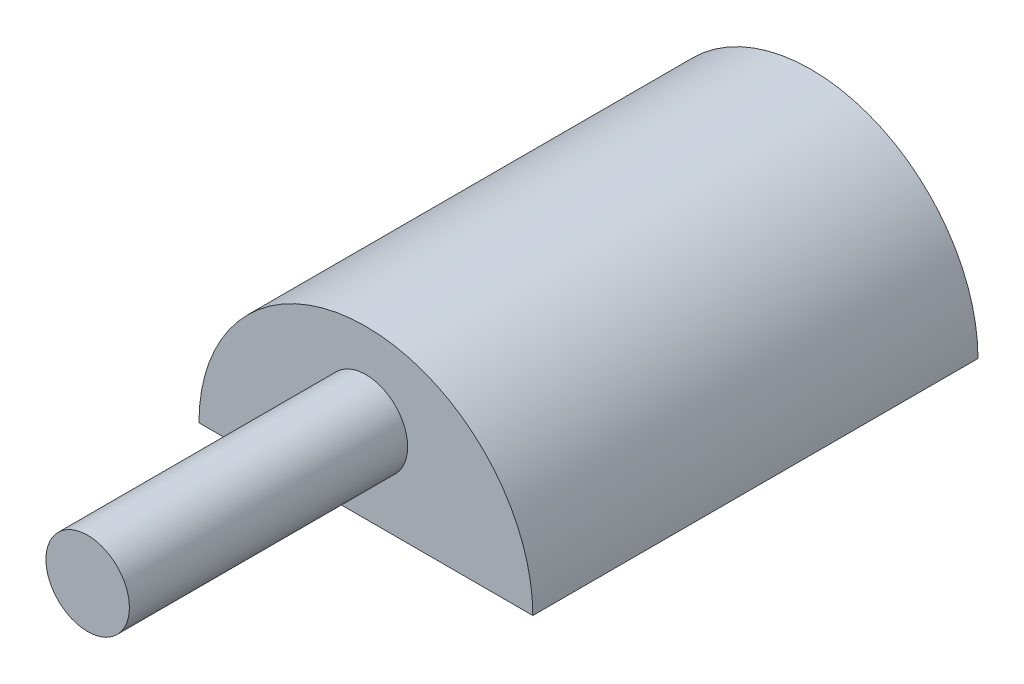
ISO-10303-21;
HEADER;
FILE_DESCRIPTION(('STEP AP214'),'2;1');
FILE_NAME('part.step','',(''),(''),'','','');
FILE_SCHEMA(('AUTOMOTIVE_DESIGN { 1 0 10303 214 1 1 1 1 }'));
ENDSEC;
DATA;
#1=APPLICATION_CONTEXT('core data for automotive mechanical design processes');
#2=APPLICATION_PROTOCOL_DEFINITION('international standard','automotive_design',2000,#1);
#3=PRODUCT_CONTEXT('',#1,'mechanical');
#4=PRODUCT('Part','Part','',(#3));
#5=PRODUCT_RELATED_PRODUCT_CATEGORY('part','',(#4));
#6=PRODUCT_DEFINITION_FORMATION('','',#4);
#7=PRODUCT_DEFINITION_CONTEXT('part definition',#1,'design');
#8=PRODUCT_DEFINITION('design','',#6,#7);
#9=PRODUCT_DEFINITION_SHAPE('','',#8);
#10=(LENGTH_UNIT() NAMED_UNIT(*) SI_UNIT(.MILLI.,.METRE.));
#11=(NAMED_UNIT(*) PLANE_ANGLE_UNIT() SI_UNIT($,.RADIAN.));
#12=(NAMED_UNIT(*) SI_UNIT($,.STERADIAN.) SOLID_ANGLE_UNIT());
#13=UNCERTAINTY_MEASURE_WITH_UNIT(LENGTH_MEASURE(1.E-05),#10,'distance_accuracy_value','');
#14=(GEOMETRIC_REPRESENTATION_CONTEXT(3) GLOBAL_UNCERTAINTY_ASSIGNED_CONTEXT((#13)) GLOBAL_UNIT_ASSIGNED_CONTEXT((#10,
#11,#12)) REPRESENTATION_CONTEXT('',''));
#15=CARTESIAN_POINT('',(0.,0.,0.));
#16=DIRECTION('',(0.,0.,1.));
#17=DIRECTION('',(1.,0.,0.));
#18=AXIS2_PLACEMENT_3D('',#15,#16,#17);
#19=CARTESIAN_POINT('',(0.,0.,203.2));
#20=DIRECTION('',(0.,0.,1.));
#21=DIRECTION('',(1.,0.,0.));
#22=AXIS2_PLACEMENT_3D('',#19,#20,#21);
#23=PLANE('',#22);
#24=DIRECTION('',(1.,0.,0.));
#25=VECTOR('',#24,1.);
#26=CARTESIAN_POINT('',(0.,0.,203.2));
#27=LINE('',#26,#25);
#28=CARTESIAN_POINT('',(-76.2,0.,203.2));
#29=VERTEX_POINT('',#28);
#30=CARTESIAN_POINT('',(76.2,0.,203.2));
#31=VERTEX_POINT('',#30);
#32=EDGE_CURVE('E71',#29,#31,#27,.T.);
#33=ORIENTED_EDGE('',*,*,#32,.T.);
#34=CARTESIAN_POINT('',(0.,0.,203.2));
#35=DIRECTION('',(0.,0.,1.));
#36=DIRECTION('',(1.,0.,0.));
#37=AXIS2_PLACEMENT_3D('',#34,#35,#36);
#38=CIRCLE('',#37,76.2);
#39=EDGE_CURVE('E51',#31,#29,#38,.T.);
#40=ORIENTED_EDGE('',*,*,#39,.T.);
#41=EDGE_LOOP('',(#33,#40));
#42=FACE_BOUND('',#41,.T.);
#43=CARTESIAN_POINT('',(0.,38.1,203.2));
#44=DIRECTION('',(0.,0.,1.));
#45=DIRECTION('',(1.,0.,0.));
#46=AXIS2_PLACEMENT_3D('',#43,#44,#45);
#47=CIRCLE('',#46,19.05);
#48=CARTESIAN_POINT('',(19.05,38.1,203.2));
#49=VERTEX_POINT('',#48);
#50=EDGE_CURVE('E76',#49,#49,#47,.T.);
#51=ORIENTED_EDGE('',*,*,#50,.F.);
#52=EDGE_LOOP('',(#51));
#53=FACE_BOUND('',#52,.T.);
#54=ADVANCED_FACE('F35',(#42,#53),#23,.T.);
#55=CARTESIAN_POINT('',(0.,0.,203.2));
#56=DIRECTION('',(0.,1.,0.));
#57=DIRECTION('',(0.,0.,1.));
#58=AXIS2_PLACEMENT_3D('',#55,#56,#57);
#59=PLANE('',#58);
#60=DIRECTION('',(1.,0.,0.));
#61=VECTOR('',#60,1.);
#62=CARTESIAN_POINT('',(0.,0.,0.));
#63=LINE('',#62,#61);
#64=CARTESIAN_POINT('',(-76.2,0.,0.));
#65=VERTEX_POINT('',#64);
#66=CARTESIAN_POINT('',(76.2,0.,0.));
#67=VERTEX_POINT('',#66);
#68=EDGE_CURVE('E60',#65,#67,#63,.T.);
#69=ORIENTED_EDGE('',*,*,#68,.T.);
#70=DIRECTION('',(0.,0.,-1.));
#71=VECTOR('',#70,1.);
#72=CARTESIAN_POINT('',(76.2,0.,203.2));
#73=LINE('',#72,#71);
#74=EDGE_CURVE('E11',#31,#67,#73,.T.);
#75=ORIENTED_EDGE('',*,*,#74,.F.);
#76=ORIENTED_EDGE('',*,*,#32,.F.);
#77=DIRECTION('',(0.,0.,-1.));
#78=VECTOR('',#77,1.);
#79=CARTESIAN_POINT('',(-76.2,0.,203.2));
#80=LINE('',#79,#78);
#81=EDGE_CURVE('E44',#29,#65,#80,.T.);
#82=ORIENTED_EDGE('',*,*,#81,.T.);
#83=EDGE_LOOP('',(#69,#75,#76,#82));
#84=FACE_BOUND('',#83,.T.);
#85=ADVANCED_FACE('F37',(#84),#59,.F.);
#86=CARTESIAN_POINT('',(0.,0.,203.2));
#87=DIRECTION('',(0.,0.,-1.));
#88=DIRECTION('',(-1.,0.,0.));
#89=AXIS2_PLACEMENT_3D('',#86,#87,#88);
#90=CYLINDRICAL_SURFACE('',#89,76.2);
#91=CARTESIAN_POINT('',(0.,0.,0.));
#92=DIRECTION('',(0.,0.,1.));
#93=DIRECTION('',(1.,0.,0.));
#94=AXIS2_PLACEMENT_3D('',#91,#92,#93);
#95=CIRCLE('',#94,76.2);
#96=EDGE_CURVE('E65',#67,#65,#95,.T.);
#97=ORIENTED_EDGE('',*,*,#96,.T.);
#98=ORIENTED_EDGE('',*,*,#81,.F.);
#99=ORIENTED_EDGE('',*,*,#39,.F.);
#100=ORIENTED_EDGE('',*,*,#74,.T.);
#101=EDGE_LOOP('',(#97,#98,#99,#100));
#102=FACE_BOUND('',#101,.T.);
#103=ADVANCED_FACE('F69',(#102),#90,.T.);
#104=CARTESIAN_POINT('',(0.,0.,0.));
#105=DIRECTION('',(0.,0.,1.));
#106=DIRECTION('',(1.,0.,0.));
#107=AXIS2_PLACEMENT_3D('',#104,#105,#106);
#108=PLANE('',#107);
#109=ORIENTED_EDGE('',*,*,#68,.F.);
#110=ORIENTED_EDGE('',*,*,#96,.F.);
#111=EDGE_LOOP('',(#109,#110));
#112=FACE_BOUND('',#111,.T.);
#113=ADVANCED_FACE('F64',(#112),#108,.F.);
#114=CARTESIAN_POINT('',(0.,38.1,330.2));
#115=DIRECTION('',(0.,0.,-1.));
#116=DIRECTION('',(-1.,0.,0.));
#117=AXIS2_PLACEMENT_3D('',#114,#115,#116);
#118=CYLINDRICAL_SURFACE('',#117,19.05);
#119=CARTESIAN_POINT('',(0.,38.1,330.2));
#120=DIRECTION('',(0.,0.,1.));
#121=DIRECTION('',(1.,0.,0.));
#122=AXIS2_PLACEMENT_3D('',#119,#120,#121);
#123=CIRCLE('',#122,19.05);
#124=CARTESIAN_POINT('',(19.05,38.1,330.2));
#125=VERTEX_POINT('',#124);
#126=EDGE_CURVE('E66',#125,#125,#123,.T.);
#127=ORIENTED_EDGE('',*,*,#126,.F.);
#128=EDGE_LOOP('',(#127));
#129=FACE_BOUND('',#128,.T.);
#130=ORIENTED_EDGE('',*,*,#50,.T.);
#131=EDGE_LOOP('',(#130));
#132=FACE_BOUND('',#131,.T.);
#133=ADVANCED_FACE('F84',(#129,#132),#118,.T.);
#134=CARTESIAN_POINT('',(0.,0.,330.2));
#135=DIRECTION('',(0.,0.,1.));
#136=DIRECTION('',(1.,0.,0.));
#137=AXIS2_PLACEMENT_3D('',#134,#135,#136);
#138=PLANE('',#137);
#139=ORIENTED_EDGE('',*,*,#126,.T.);
#140=EDGE_LOOP('',(#139));
#141=FACE_BOUND('',#140,.T.);
#142=ADVANCED_FACE('F82',(#141),#138,.T.);
#143=CLOSED_SHELL('',(#54,#85,#103,#113,#133,#142));
#144=MANIFOLD_SOLID_BREP('B2',#143);
#145=ADVANCED_BREP_SHAPE_REPRESENTATION('',(#18,#144),#14);
#146=SHAPE_DEFINITION_REPRESENTATION(#9,#145);
ENDSEC;
END-ISO-10303-21;
